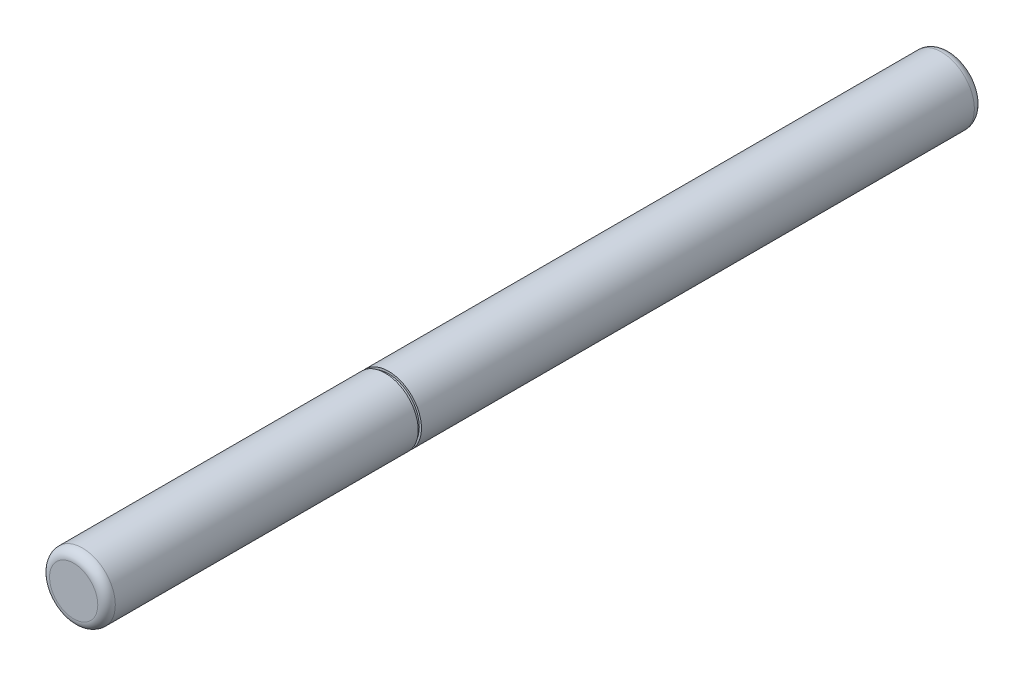
ISO-10303-21;
HEADER;
FILE_DESCRIPTION(('STEP AP214'),'2;1');
FILE_NAME('part.step','',(''),(''),'','','');
FILE_SCHEMA(('AUTOMOTIVE_DESIGN { 1 0 10303 214 1 1 1 1 }'));
ENDSEC;
DATA;
#1=APPLICATION_CONTEXT('core data for automotive mechanical design processes');
#2=APPLICATION_PROTOCOL_DEFINITION('international standard','automotive_design',2000,#1);
#3=PRODUCT_CONTEXT('',#1,'mechanical');
#4=PRODUCT('Part','Part','',(#3));
#5=PRODUCT_RELATED_PRODUCT_CATEGORY('part','',(#4));
#6=PRODUCT_DEFINITION_FORMATION('','',#4);
#7=PRODUCT_DEFINITION_CONTEXT('part definition',#1,'design');
#8=PRODUCT_DEFINITION('design','',#6,#7);
#9=PRODUCT_DEFINITION_SHAPE('','',#8);
#10=(LENGTH_UNIT() NAMED_UNIT(*) SI_UNIT(.MILLI.,.METRE.));
#11=(NAMED_UNIT(*) PLANE_ANGLE_UNIT() SI_UNIT($,.RADIAN.));
#12=(NAMED_UNIT(*) SI_UNIT($,.STERADIAN.) SOLID_ANGLE_UNIT());
#13=UNCERTAINTY_MEASURE_WITH_UNIT(LENGTH_MEASURE(1.E-05),#10,'distance_accuracy_value','');
#14=(GEOMETRIC_REPRESENTATION_CONTEXT(3) GLOBAL_UNCERTAINTY_ASSIGNED_CONTEXT((#13)) GLOBAL_UNIT_ASSIGNED_CONTEXT((#10,
#11,#12)) REPRESENTATION_CONTEXT('',''));
#15=CARTESIAN_POINT('',(0.,0.,0.));
#16=DIRECTION('',(0.,0.,1.));
#17=DIRECTION('',(1.,0.,0.));
#18=AXIS2_PLACEMENT_3D('',#15,#16,#17);
#19=CARTESIAN_POINT('',(0.,0.,40.));
#20=DIRECTION('',(0.,0.,-1.));
#21=DIRECTION('',(-1.,0.,0.));
#22=AXIS2_PLACEMENT_3D('',#19,#20,#21);
#23=CYLINDRICAL_SURFACE('',#22,1.5);
#24=CARTESIAN_POINT('',(0.,0.,0.399999999999998));
#25=DIRECTION('',(0.,0.,1.));
#26=DIRECTION('',(1.,0.,0.));
#27=AXIS2_PLACEMENT_3D('',#24,#25,#26);
#28=CIRCLE('',#27,1.5);
#29=CARTESIAN_POINT('',(1.5,0.,0.399999999999998));
#30=VERTEX_POINT('',#29);
#31=EDGE_CURVE('E43',#30,#30,#28,.T.);
#32=ORIENTED_EDGE('',*,*,#31,.T.);
#33=EDGE_LOOP('',(#32));
#34=FACE_BOUND('',#33,.T.);
#35=CARTESIAN_POINT('',(0.,0.,25.63));
#36=DIRECTION('',(0.,0.,1.));
#37=DIRECTION('',(1.,0.,0.));
#38=AXIS2_PLACEMENT_3D('',#35,#36,#37);
#39=CIRCLE('',#38,1.5);
#40=CARTESIAN_POINT('',(1.5,0.,25.63));
#41=VERTEX_POINT('',#40);
#42=EDGE_CURVE('E34',#41,#41,#39,.T.);
#43=ORIENTED_EDGE('',*,*,#42,.F.);
#44=EDGE_LOOP('',(#43));
#45=FACE_BOUND('',#44,.T.);
#46=ADVANCED_FACE('F30',(#34,#45),#23,.T.);
#47=CARTESIAN_POINT('',(0.,0.,0.));
#48=DIRECTION('',(0.,0.,1.));
#49=DIRECTION('',(1.,0.,0.));
#50=AXIS2_PLACEMENT_3D('',#47,#48,#49);
#51=PLANE('',#50);
#52=CARTESIAN_POINT('',(0.,0.,0.));
#53=DIRECTION('',(0.,0.,1.));
#54=DIRECTION('',(1.,0.,0.));
#55=AXIS2_PLACEMENT_3D('',#52,#53,#54);
#56=CIRCLE('',#55,1.1);
#57=CARTESIAN_POINT('',(1.1,0.,0.));
#58=VERTEX_POINT('',#57);
#59=EDGE_CURVE('E38',#58,#58,#56,.F.);
#60=ORIENTED_EDGE('',*,*,#59,.T.);
#61=EDGE_LOOP('',(#60));
#62=FACE_BOUND('',#61,.T.);
#63=ADVANCED_FACE('F70',(#62),#51,.F.);
#64=CARTESIAN_POINT('',(0.,0.,0.399999999999998));
#65=DIRECTION('',(0.,0.,1.));
#66=DIRECTION('',(1.,0.,0.));
#67=AXIS2_PLACEMENT_3D('',#64,#65,#66);
#68=TOROIDAL_SURFACE('',#67,1.1,0.4);
#69=ORIENTED_EDGE('',*,*,#59,.F.);
#70=EDGE_LOOP('',(#69));
#71=FACE_BOUND('',#70,.T.);
#72=ORIENTED_EDGE('',*,*,#31,.F.);
#73=EDGE_LOOP('',(#72));
#74=FACE_BOUND('',#73,.T.);
#75=ADVANCED_FACE('F67',(#71,#74),#68,.T.);
#76=CARTESIAN_POINT('',(0.,0.,25.63));
#77=DIRECTION('',(0.,0.,1.));
#78=DIRECTION('',(1.,0.,0.));
#79=AXIS2_PLACEMENT_3D('',#76,#77,#78);
#80=PLANE('',#79);
#81=CARTESIAN_POINT('',(0.,0.,25.63));
#82=DIRECTION('',(0.,0.,1.));
#83=DIRECTION('',(1.,0.,0.));
#84=AXIS2_PLACEMENT_3D('',#81,#82,#83);
#85=CIRCLE('',#84,1.4);
#86=CARTESIAN_POINT('',(1.4,0.,25.63));
#87=VERTEX_POINT('',#86);
#88=EDGE_CURVE('E48',#87,#87,#85,.T.);
#89=ORIENTED_EDGE('',*,*,#88,.F.);
#90=EDGE_LOOP('',(#89));
#91=FACE_BOUND('',#90,.T.);
#92=ORIENTED_EDGE('',*,*,#42,.T.);
#93=EDGE_LOOP('',(#92));
#94=FACE_BOUND('',#93,.T.);
#95=ADVANCED_FACE('F69',(#91,#94),#80,.T.);
#96=CARTESIAN_POINT('',(0.,0.,25.78));
#97=DIRECTION('',(0.,0.,1.));
#98=DIRECTION('',(1.,0.,0.));
#99=AXIS2_PLACEMENT_3D('',#96,#97,#98);
#100=PLANE('',#99);
#101=CARTESIAN_POINT('',(0.,0.,25.78));
#102=DIRECTION('',(0.,0.,1.));
#103=DIRECTION('',(1.,0.,0.));
#104=AXIS2_PLACEMENT_3D('',#101,#102,#103);
#105=CIRCLE('',#104,1.4);
#106=CARTESIAN_POINT('',(1.4,0.,25.78));
#107=VERTEX_POINT('',#106);
#108=EDGE_CURVE('E54',#107,#107,#105,.T.);
#109=ORIENTED_EDGE('',*,*,#108,.T.);
#110=EDGE_LOOP('',(#109));
#111=FACE_BOUND('',#110,.T.);
#112=CARTESIAN_POINT('',(0.,0.,25.78));
#113=DIRECTION('',(0.,0.,1.));
#114=DIRECTION('',(1.,0.,0.));
#115=AXIS2_PLACEMENT_3D('',#112,#113,#114);
#116=CIRCLE('',#115,1.5);
#117=CARTESIAN_POINT('',(1.5,0.,25.78));
#118=VERTEX_POINT('',#117);
#119=EDGE_CURVE('E46',#118,#118,#116,.T.);
#120=ORIENTED_EDGE('',*,*,#119,.F.);
#121=EDGE_LOOP('',(#120));
#122=FACE_BOUND('',#121,.T.);
#123=ADVANCED_FACE('F76',(#111,#122),#100,.F.);
#124=CARTESIAN_POINT('',(0.,0.,25.63));
#125=DIRECTION('',(0.,0.,1.));
#126=DIRECTION('',(1.,0.,0.));
#127=AXIS2_PLACEMENT_3D('',#124,#125,#126);
#128=CYLINDRICAL_SURFACE('',#127,1.4);
#129=ORIENTED_EDGE('',*,*,#88,.T.);
#130=EDGE_LOOP('',(#129));
#131=FACE_BOUND('',#130,.T.);
#132=ORIENTED_EDGE('',*,*,#108,.F.);
#133=EDGE_LOOP('',(#132));
#134=FACE_BOUND('',#133,.T.);
#135=ADVANCED_FACE('F99',(#131,#134),#128,.T.);
#136=CARTESIAN_POINT('',(0.,0.,40.));
#137=DIRECTION('',(0.,0.,1.));
#138=DIRECTION('',(1.,0.,0.));
#139=AXIS2_PLACEMENT_3D('',#136,#137,#138);
#140=PLANE('',#139);
#141=CARTESIAN_POINT('',(0.,0.,40.));
#142=DIRECTION('',(0.,0.,1.));
#143=DIRECTION('',(1.,0.,0.));
#144=AXIS2_PLACEMENT_3D('',#141,#142,#143);
#145=CIRCLE('',#144,1.1);
#146=CARTESIAN_POINT('',(1.1,0.,40.));
#147=VERTEX_POINT('',#146);
#148=EDGE_CURVE('E10',#147,#147,#145,.T.);
#149=ORIENTED_EDGE('',*,*,#148,.T.);
#150=EDGE_LOOP('',(#149));
#151=FACE_BOUND('',#150,.T.);
#152=ADVANCED_FACE('F91',(#151),#140,.T.);
#153=CARTESIAN_POINT('',(0.,0.,39.6));
#154=DIRECTION('',(0.,0.,1.));
#155=DIRECTION('',(1.,0.,0.));
#156=AXIS2_PLACEMENT_3D('',#153,#154,#155);
#157=TOROIDAL_SURFACE('',#156,1.1,0.4);
#158=CARTESIAN_POINT('',(0.,0.,39.6));
#159=DIRECTION('',(0.,0.,1.));
#160=DIRECTION('',(1.,0.,0.));
#161=AXIS2_PLACEMENT_3D('',#158,#159,#160);
#162=CIRCLE('',#161,1.5);
#163=CARTESIAN_POINT('',(1.5,0.,39.6));
#164=VERTEX_POINT('',#163);
#165=EDGE_CURVE('E52',#164,#164,#162,.F.);
#166=ORIENTED_EDGE('',*,*,#165,.F.);
#167=EDGE_LOOP('',(#166));
#168=FACE_BOUND('',#167,.T.);
#169=ORIENTED_EDGE('',*,*,#148,.F.);
#170=EDGE_LOOP('',(#169));
#171=FACE_BOUND('',#170,.T.);
#172=ADVANCED_FACE('F32',(#168,#171),#157,.T.);
#173=ORIENTED_EDGE('',*,*,#119,.T.);
#174=EDGE_LOOP('',(#173));
#175=FACE_BOUND('',#174,.T.);
#176=ORIENTED_EDGE('',*,*,#165,.T.);
#177=EDGE_LOOP('',(#176));
#178=FACE_BOUND('',#177,.T.);
#179=ADVANCED_FACE('F84',(#175,#178),#23,.T.);
#180=CLOSED_SHELL('',(#46,#63,#75,#95,#123,#135,#152,#172,#179));
#181=MANIFOLD_SOLID_BREP('B2',#180);
#182=ADVANCED_BREP_SHAPE_REPRESENTATION('',(#18,#181),#14);
#183=SHAPE_DEFINITION_REPRESENTATION(#9,#182);
ENDSEC;
END-ISO-10303-21;
